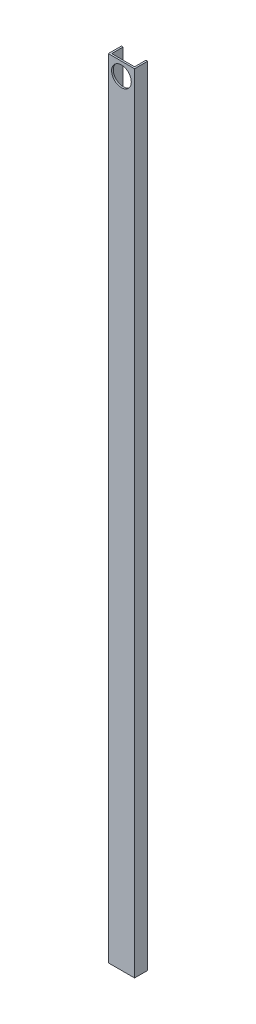
ISO-10303-21;
HEADER;
FILE_DESCRIPTION(('STEP AP214'),'2;1');
FILE_NAME('part.step','',(''),(''),'','','');
FILE_SCHEMA(('AUTOMOTIVE_DESIGN { 1 0 10303 214 1 1 1 1 }'));
ENDSEC;
DATA;
#1=APPLICATION_CONTEXT('core data for automotive mechanical design processes');
#2=APPLICATION_PROTOCOL_DEFINITION('international standard','automotive_design',2000,#1);
#3=PRODUCT_CONTEXT('',#1,'mechanical');
#4=PRODUCT('Part','Part','',(#3));
#5=PRODUCT_RELATED_PRODUCT_CATEGORY('part','',(#4));
#6=PRODUCT_DEFINITION_FORMATION('','',#4);
#7=PRODUCT_DEFINITION_CONTEXT('part definition',#1,'design');
#8=PRODUCT_DEFINITION('design','',#6,#7);
#9=PRODUCT_DEFINITION_SHAPE('','',#8);
#10=(LENGTH_UNIT() NAMED_UNIT(*) SI_UNIT(.MILLI.,.METRE.));
#11=(NAMED_UNIT(*) PLANE_ANGLE_UNIT() SI_UNIT($,.RADIAN.));
#12=(NAMED_UNIT(*) SI_UNIT($,.STERADIAN.) SOLID_ANGLE_UNIT());
#13=UNCERTAINTY_MEASURE_WITH_UNIT(LENGTH_MEASURE(1.E-05),#10,'distance_accuracy_value','');
#14=(GEOMETRIC_REPRESENTATION_CONTEXT(3) GLOBAL_UNCERTAINTY_ASSIGNED_CONTEXT((#13)) GLOBAL_UNIT_ASSIGNED_CONTEXT((#10,
#11,#12)) REPRESENTATION_CONTEXT('',''));
#15=CARTESIAN_POINT('',(0.,0.,0.));
#16=DIRECTION('',(0.,0.,1.));
#17=DIRECTION('',(1.,0.,0.));
#18=AXIS2_PLACEMENT_3D('',#15,#16,#17);
#19=CARTESIAN_POINT('',(0.,1524.,-25.4));
#20=DIRECTION('',(1.,0.,0.));
#21=DIRECTION('',(0.,0.,-1.));
#22=AXIS2_PLACEMENT_3D('',#19,#20,#21);
#23=PLANE('',#22);
#24=DIRECTION('',(0.,0.,1.));
#25=VECTOR('',#24,1.);
#26=CARTESIAN_POINT('',(0.,0.,-25.4));
#27=LINE('',#26,#25);
#28=CARTESIAN_POINT('',(0.,0.,-25.4));
#29=VERTEX_POINT('',#28);
#30=CARTESIAN_POINT('',(0.,0.,0.));
#31=VERTEX_POINT('',#30);
#32=EDGE_CURVE('E129',#29,#31,#27,.T.);
#33=ORIENTED_EDGE('',*,*,#32,.T.);
#34=DIRECTION('',(0.,-1.,0.));
#35=VECTOR('',#34,1.);
#36=CARTESIAN_POINT('',(0.,1524.,0.));
#37=LINE('',#36,#35);
#38=CARTESIAN_POINT('',(0.,1524.,0.));
#39=VERTEX_POINT('',#38);
#40=EDGE_CURVE('E11',#39,#31,#37,.T.);
#41=ORIENTED_EDGE('',*,*,#40,.F.);
#42=DIRECTION('',(0.,0.,1.));
#43=VECTOR('',#42,1.);
#44=CARTESIAN_POINT('',(0.,1524.,-25.4));
#45=LINE('',#44,#43);
#46=CARTESIAN_POINT('',(0.,1524.,-25.4));
#47=VERTEX_POINT('',#46);
#48=EDGE_CURVE('E144',#47,#39,#45,.T.);
#49=ORIENTED_EDGE('',*,*,#48,.F.);
#50=DIRECTION('',(0.,-1.,0.));
#51=VECTOR('',#50,1.);
#52=CARTESIAN_POINT('',(0.,1524.,-25.4));
#53=LINE('',#52,#51);
#54=EDGE_CURVE('E125',#47,#29,#53,.T.);
#55=ORIENTED_EDGE('',*,*,#54,.T.);
#56=EDGE_LOOP('',(#33,#41,#49,#55));
#57=FACE_BOUND('',#56,.T.);
#58=ADVANCED_FACE('F33',(#57),#23,.F.);
#59=CARTESIAN_POINT('',(0.,1524.,0.));
#60=DIRECTION('',(0.,0.,-1.));
#61=DIRECTION('',(-1.,0.,0.));
#62=AXIS2_PLACEMENT_3D('',#59,#60,#61);
#63=PLANE('',#62);
#64=CARTESIAN_POINT('',(25.4,1498.6,0.));
#65=DIRECTION('',(0.,0.,1.));
#66=DIRECTION('',(1.,0.,0.));
#67=AXIS2_PLACEMENT_3D('',#64,#65,#66);
#68=CIRCLE('',#67,19.05);
#69=CARTESIAN_POINT('',(44.45,1498.6,0.));
#70=VERTEX_POINT('',#69);
#71=EDGE_CURVE('E177',#70,#70,#68,.T.);
#72=ORIENTED_EDGE('',*,*,#71,.F.);
#73=EDGE_LOOP('',(#72));
#74=FACE_BOUND('',#73,.T.);
#75=DIRECTION('',(1.,0.,0.));
#76=VECTOR('',#75,1.);
#77=CARTESIAN_POINT('',(0.,0.,0.));
#78=LINE('',#77,#76);
#79=CARTESIAN_POINT('',(50.8,0.,0.));
#80=VERTEX_POINT('',#79);
#81=EDGE_CURVE('E132',#31,#80,#78,.T.);
#82=ORIENTED_EDGE('',*,*,#81,.T.);
#83=DIRECTION('',(0.,-1.,0.));
#84=VECTOR('',#83,1.);
#85=CARTESIAN_POINT('',(50.8,1524.,0.));
#86=LINE('',#85,#84);
#87=CARTESIAN_POINT('',(50.8,1524.,0.));
#88=VERTEX_POINT('',#87);
#89=EDGE_CURVE('E41',#88,#80,#86,.T.);
#90=ORIENTED_EDGE('',*,*,#89,.F.);
#91=DIRECTION('',(1.,0.,0.));
#92=VECTOR('',#91,1.);
#93=CARTESIAN_POINT('',(0.,1524.,0.));
#94=LINE('',#93,#92);
#95=EDGE_CURVE('E92',#39,#88,#94,.T.);
#96=ORIENTED_EDGE('',*,*,#95,.F.);
#97=ORIENTED_EDGE('',*,*,#40,.T.);
#98=EDGE_LOOP('',(#82,#90,#96,#97));
#99=FACE_BOUND('',#98,.T.);
#100=ADVANCED_FACE('F190',(#74,#99),#63,.F.);
#101=CARTESIAN_POINT('',(50.8,1524.,0.));
#102=DIRECTION('',(-1.,0.,0.));
#103=DIRECTION('',(0.,0.,1.));
#104=AXIS2_PLACEMENT_3D('',#101,#102,#103);
#105=PLANE('',#104);
#106=DIRECTION('',(0.,0.,-1.));
#107=VECTOR('',#106,1.);
#108=CARTESIAN_POINT('',(50.8,0.,0.));
#109=LINE('',#108,#107);
#110=CARTESIAN_POINT('',(50.8,0.,-25.4));
#111=VERTEX_POINT('',#110);
#112=EDGE_CURVE('E135',#80,#111,#109,.T.);
#113=ORIENTED_EDGE('',*,*,#112,.T.);
#114=DIRECTION('',(0.,-1.,0.));
#115=VECTOR('',#114,1.);
#116=CARTESIAN_POINT('',(50.8,1524.,-25.4));
#117=LINE('',#116,#115);
#118=CARTESIAN_POINT('',(50.8,1524.,-25.4));
#119=VERTEX_POINT('',#118);
#120=EDGE_CURVE('E151',#119,#111,#117,.T.);
#121=ORIENTED_EDGE('',*,*,#120,.F.);
#122=DIRECTION('',(0.,0.,-1.));
#123=VECTOR('',#122,1.);
#124=CARTESIAN_POINT('',(50.8,1524.,0.));
#125=LINE('',#124,#123);
#126=EDGE_CURVE('E159',#88,#119,#125,.T.);
#127=ORIENTED_EDGE('',*,*,#126,.F.);
#128=ORIENTED_EDGE('',*,*,#89,.T.);
#129=EDGE_LOOP('',(#113,#121,#127,#128));
#130=FACE_BOUND('',#129,.T.);
#131=ADVANCED_FACE('F157',(#130),#105,.F.);
#132=CARTESIAN_POINT('',(50.8,1524.,-25.4));
#133=DIRECTION('',(0.,0.,1.));
#134=DIRECTION('',(1.,0.,0.));
#135=AXIS2_PLACEMENT_3D('',#132,#133,#134);
#136=PLANE('',#135);
#137=DIRECTION('',(-1.,0.,0.));
#138=VECTOR('',#137,1.);
#139=CARTESIAN_POINT('',(50.8,0.,-25.4));
#140=LINE('',#139,#138);
#141=CARTESIAN_POINT('',(47.498,0.,-25.4));
#142=VERTEX_POINT('',#141);
#143=EDGE_CURVE('E137',#111,#142,#140,.T.);
#144=ORIENTED_EDGE('',*,*,#143,.T.);
#145=DIRECTION('',(0.,-1.,0.));
#146=VECTOR('',#145,1.);
#147=CARTESIAN_POINT('',(47.498,1524.,-25.4));
#148=LINE('',#147,#146);
#149=CARTESIAN_POINT('',(47.498,1524.,-25.4));
#150=VERTEX_POINT('',#149);
#151=EDGE_CURVE('E148',#150,#142,#148,.T.);
#152=ORIENTED_EDGE('',*,*,#151,.F.);
#153=DIRECTION('',(-1.,0.,0.));
#154=VECTOR('',#153,1.);
#155=CARTESIAN_POINT('',(50.8,1524.,-25.4));
#156=LINE('',#155,#154);
#157=EDGE_CURVE('E171',#119,#150,#156,.T.);
#158=ORIENTED_EDGE('',*,*,#157,.F.);
#159=ORIENTED_EDGE('',*,*,#120,.T.);
#160=EDGE_LOOP('',(#144,#152,#158,#159));
#161=FACE_BOUND('',#160,.T.);
#162=ADVANCED_FACE('F167',(#161),#136,.F.);
#163=CARTESIAN_POINT('',(47.498,1524.,-25.4));
#164=DIRECTION('',(1.,0.,0.));
#165=DIRECTION('',(0.,0.,-1.));
#166=AXIS2_PLACEMENT_3D('',#163,#164,#165);
#167=PLANE('',#166);
#168=DIRECTION('',(0.,0.,1.));
#169=VECTOR('',#168,1.);
#170=CARTESIAN_POINT('',(47.498,0.,-25.4));
#171=LINE('',#170,#169);
#172=CARTESIAN_POINT('',(47.498,0.,-3.302));
#173=VERTEX_POINT('',#172);
#174=EDGE_CURVE('E139',#142,#173,#171,.T.);
#175=ORIENTED_EDGE('',*,*,#174,.T.);
#176=DIRECTION('',(0.,-1.,0.));
#177=VECTOR('',#176,1.);
#178=CARTESIAN_POINT('',(47.498,1524.,-3.302));
#179=LINE('',#178,#177);
#180=CARTESIAN_POINT('',(47.498,1524.,-3.302));
#181=VERTEX_POINT('',#180);
#182=EDGE_CURVE('E120',#181,#173,#179,.T.);
#183=ORIENTED_EDGE('',*,*,#182,.F.);
#184=DIRECTION('',(0.,0.,1.));
#185=VECTOR('',#184,1.);
#186=CARTESIAN_POINT('',(47.498,1524.,-25.4));
#187=LINE('',#186,#185);
#188=EDGE_CURVE('E111',#150,#181,#187,.T.);
#189=ORIENTED_EDGE('',*,*,#188,.F.);
#190=ORIENTED_EDGE('',*,*,#151,.T.);
#191=EDGE_LOOP('',(#175,#183,#189,#190));
#192=FACE_BOUND('',#191,.T.);
#193=ADVANCED_FACE('F170',(#192),#167,.F.);
#194=CARTESIAN_POINT('',(47.498,1524.,-3.302));
#195=DIRECTION('',(0.,0.,1.));
#196=DIRECTION('',(1.,0.,0.));
#197=AXIS2_PLACEMENT_3D('',#194,#195,#196);
#198=PLANE('',#197);
#199=CARTESIAN_POINT('',(25.4,1498.6,-3.302));
#200=DIRECTION('',(0.,0.,1.));
#201=DIRECTION('',(1.,0.,0.));
#202=AXIS2_PLACEMENT_3D('',#199,#200,#201);
#203=CIRCLE('',#202,19.05);
#204=CARTESIAN_POINT('',(44.45,1498.6,-3.302));
#205=VERTEX_POINT('',#204);
#206=EDGE_CURVE('E133',#205,#205,#203,.T.);
#207=ORIENTED_EDGE('',*,*,#206,.T.);
#208=EDGE_LOOP('',(#207));
#209=FACE_BOUND('',#208,.T.);
#210=DIRECTION('',(-1.,0.,0.));
#211=VECTOR('',#210,1.);
#212=CARTESIAN_POINT('',(47.498,0.,-3.302));
#213=LINE('',#212,#211);
#214=CARTESIAN_POINT('',(3.302,0.,-3.30199999999999));
#215=VERTEX_POINT('',#214);
#216=EDGE_CURVE('E119',#173,#215,#213,.T.);
#217=ORIENTED_EDGE('',*,*,#216,.T.);
#218=DIRECTION('',(0.,-1.,0.));
#219=VECTOR('',#218,1.);
#220=CARTESIAN_POINT('',(3.302,1524.,-3.30199999999999));
#221=LINE('',#220,#219);
#222=CARTESIAN_POINT('',(3.302,1524.,-3.30199999999999));
#223=VERTEX_POINT('',#222);
#224=EDGE_CURVE('E116',#223,#215,#221,.T.);
#225=ORIENTED_EDGE('',*,*,#224,.F.);
#226=DIRECTION('',(-1.,0.,0.));
#227=VECTOR('',#226,1.);
#228=CARTESIAN_POINT('',(47.498,1524.,-3.302));
#229=LINE('',#228,#227);
#230=EDGE_CURVE('E105',#181,#223,#229,.T.);
#231=ORIENTED_EDGE('',*,*,#230,.F.);
#232=ORIENTED_EDGE('',*,*,#182,.T.);
#233=EDGE_LOOP('',(#217,#225,#231,#232));
#234=FACE_BOUND('',#233,.T.);
#235=ADVANCED_FACE('F117',(#209,#234),#198,.F.);
#236=CARTESIAN_POINT('',(3.302,1524.,-3.30199999999999));
#237=DIRECTION('',(-1.,0.,0.));
#238=DIRECTION('',(0.,0.,1.));
#239=AXIS2_PLACEMENT_3D('',#236,#237,#238);
#240=PLANE('',#239);
#241=DIRECTION('',(0.,0.,-1.));
#242=VECTOR('',#241,1.);
#243=CARTESIAN_POINT('',(3.302,0.,-3.30199999999999));
#244=LINE('',#243,#242);
#245=CARTESIAN_POINT('',(3.302,0.,-25.4));
#246=VERTEX_POINT('',#245);
#247=EDGE_CURVE('E78',#215,#246,#244,.T.);
#248=ORIENTED_EDGE('',*,*,#247,.T.);
#249=DIRECTION('',(0.,-1.,0.));
#250=VECTOR('',#249,1.);
#251=CARTESIAN_POINT('',(3.302,1524.,-25.4));
#252=LINE('',#251,#250);
#253=CARTESIAN_POINT('',(3.302,1524.,-25.4));
#254=VERTEX_POINT('',#253);
#255=EDGE_CURVE('E121',#254,#246,#252,.T.);
#256=ORIENTED_EDGE('',*,*,#255,.F.);
#257=DIRECTION('',(0.,0.,-1.));
#258=VECTOR('',#257,1.);
#259=CARTESIAN_POINT('',(3.302,1524.,-3.30199999999999));
#260=LINE('',#259,#258);
#261=EDGE_CURVE('E109',#223,#254,#260,.T.);
#262=ORIENTED_EDGE('',*,*,#261,.F.);
#263=ORIENTED_EDGE('',*,*,#224,.T.);
#264=EDGE_LOOP('',(#248,#256,#262,#263));
#265=FACE_BOUND('',#264,.T.);
#266=ADVANCED_FACE('F123',(#265),#240,.F.);
#267=CARTESIAN_POINT('',(3.302,1524.,-25.4));
#268=DIRECTION('',(0.,0.,1.));
#269=DIRECTION('',(1.,0.,0.));
#270=AXIS2_PLACEMENT_3D('',#267,#268,#269);
#271=PLANE('',#270);
#272=DIRECTION('',(-1.,0.,0.));
#273=VECTOR('',#272,1.);
#274=CARTESIAN_POINT('',(3.302,0.,-25.4));
#275=LINE('',#274,#273);
#276=EDGE_CURVE('E84',#246,#29,#275,.T.);
#277=ORIENTED_EDGE('',*,*,#276,.T.);
#278=ORIENTED_EDGE('',*,*,#54,.F.);
#279=DIRECTION('',(-1.,0.,0.));
#280=VECTOR('',#279,1.);
#281=CARTESIAN_POINT('',(3.302,1524.,-25.4));
#282=LINE('',#281,#280);
#283=EDGE_CURVE('E49',#254,#47,#282,.T.);
#284=ORIENTED_EDGE('',*,*,#283,.F.);
#285=ORIENTED_EDGE('',*,*,#255,.T.);
#286=EDGE_LOOP('',(#277,#278,#284,#285));
#287=FACE_BOUND('',#286,.T.);
#288=ADVANCED_FACE('F195',(#287),#271,.F.);
#289=CARTESIAN_POINT('',(0.,1524.,0.));
#290=DIRECTION('',(0.,1.,0.));
#291=DIRECTION('',(0.,0.,1.));
#292=AXIS2_PLACEMENT_3D('',#289,#290,#291);
#293=PLANE('',#292);
#294=ORIENTED_EDGE('',*,*,#48,.T.);
#295=ORIENTED_EDGE('',*,*,#95,.T.);
#296=ORIENTED_EDGE('',*,*,#126,.T.);
#297=ORIENTED_EDGE('',*,*,#157,.T.);
#298=ORIENTED_EDGE('',*,*,#188,.T.);
#299=ORIENTED_EDGE('',*,*,#230,.T.);
#300=ORIENTED_EDGE('',*,*,#261,.T.);
#301=ORIENTED_EDGE('',*,*,#283,.T.);
#302=EDGE_LOOP('',(#294,#295,#296,#297,#298,#299,#300,#301));
#303=FACE_BOUND('',#302,.T.);
#304=ADVANCED_FACE('F107',(#303),#293,.T.);
#305=CARTESIAN_POINT('',(0.,0.,0.));
#306=DIRECTION('',(0.,1.,0.));
#307=DIRECTION('',(0.,0.,1.));
#308=AXIS2_PLACEMENT_3D('',#305,#306,#307);
#309=PLANE('',#308);
#310=ORIENTED_EDGE('',*,*,#32,.F.);
#311=ORIENTED_EDGE('',*,*,#276,.F.);
#312=ORIENTED_EDGE('',*,*,#247,.F.);
#313=ORIENTED_EDGE('',*,*,#216,.F.);
#314=ORIENTED_EDGE('',*,*,#174,.F.);
#315=ORIENTED_EDGE('',*,*,#143,.F.);
#316=ORIENTED_EDGE('',*,*,#112,.F.);
#317=ORIENTED_EDGE('',*,*,#81,.F.);
#318=EDGE_LOOP('',(#310,#311,#312,#313,#314,#315,#316,#317));
#319=FACE_BOUND('',#318,.T.);
#320=ADVANCED_FACE('F163',(#319),#309,.F.);
#321=CARTESIAN_POINT('',(25.4,1498.6,-3.302));
#322=DIRECTION('',(0.,0.,1.));
#323=DIRECTION('',(1.,0.,0.));
#324=AXIS2_PLACEMENT_3D('',#321,#322,#323);
#325=CYLINDRICAL_SURFACE('',#324,19.05);
#326=CARTESIAN_POINT('',(44.45,1498.6,-3.302));
#327=CARTESIAN_POINT('',(44.45,1498.6,-3.26760416666667));
#328=CARTESIAN_POINT('',(44.45,1498.6,-3.23320833333333));
#329=CARTESIAN_POINT('',(44.45,1498.6,-3.16441666666667));
#330=CARTESIAN_POINT('',(44.45,1498.6,-3.13002083333333));
#331=CARTESIAN_POINT('',(44.45,1498.6,-3.06122916666667));
#332=CARTESIAN_POINT('',(44.45,1498.6,-3.02683333333333));
#333=CARTESIAN_POINT('',(44.45,1498.6,-2.95804166666667));
#334=CARTESIAN_POINT('',(44.45,1498.6,-2.92364583333333));
#335=CARTESIAN_POINT('',(44.45,1498.6,-2.85485416666667));
#336=CARTESIAN_POINT('',(44.45,1498.6,-2.82045833333333));
#337=CARTESIAN_POINT('',(44.45,1498.6,-2.75166666666667));
#338=CARTESIAN_POINT('',(44.45,1498.6,-2.71727083333333));
#339=CARTESIAN_POINT('',(44.45,1498.6,-2.64847916666667));
#340=CARTESIAN_POINT('',(44.45,1498.6,-2.61408333333333));
#341=CARTESIAN_POINT('',(44.45,1498.6,-2.54529166666667));
#342=CARTESIAN_POINT('',(44.45,1498.6,-2.51089583333333));
#343=CARTESIAN_POINT('',(44.45,1498.6,-2.44210416666667));
#344=CARTESIAN_POINT('',(44.45,1498.6,-2.40770833333333));
#345=CARTESIAN_POINT('',(44.45,1498.6,-2.33891666666667));
#346=CARTESIAN_POINT('',(44.45,1498.6,-2.30452083333333));
#347=CARTESIAN_POINT('',(44.45,1498.6,-2.23572916666667));
#348=CARTESIAN_POINT('',(44.45,1498.6,-2.20133333333333));
#349=CARTESIAN_POINT('',(44.45,1498.6,-2.13254166666667));
#350=CARTESIAN_POINT('',(44.45,1498.6,-2.09814583333333));
#351=CARTESIAN_POINT('',(44.45,1498.6,-2.02935416666667));
#352=CARTESIAN_POINT('',(44.45,1498.6,-1.99495833333333));
#353=CARTESIAN_POINT('',(44.45,1498.6,-1.92616666666667));
#354=CARTESIAN_POINT('',(44.45,1498.6,-1.89177083333333));
#355=CARTESIAN_POINT('',(44.45,1498.6,-1.82297916666667));
#356=CARTESIAN_POINT('',(44.45,1498.6,-1.78858333333333));
#357=CARTESIAN_POINT('',(44.45,1498.6,-1.71979166666667));
#358=CARTESIAN_POINT('',(44.45,1498.6,-1.68539583333333));
#359=CARTESIAN_POINT('',(44.45,1498.6,-1.61660416666667));
#360=CARTESIAN_POINT('',(44.45,1498.6,-1.58220833333333));
#361=CARTESIAN_POINT('',(44.45,1498.6,-1.51341666666667));
#362=CARTESIAN_POINT('',(44.45,1498.6,-1.47902083333333));
#363=CARTESIAN_POINT('',(44.45,1498.6,-1.41022916666667));
#364=CARTESIAN_POINT('',(44.45,1498.6,-1.37583333333333));
#365=CARTESIAN_POINT('',(44.45,1498.6,-1.30704166666667));
#366=CARTESIAN_POINT('',(44.45,1498.6,-1.27264583333333));
#367=CARTESIAN_POINT('',(44.45,1498.6,-1.20385416666667));
#368=CARTESIAN_POINT('',(44.45,1498.6,-1.16945833333333));
#369=CARTESIAN_POINT('',(44.45,1498.6,-1.10066666666667));
#370=CARTESIAN_POINT('',(44.45,1498.6,-1.06627083333333));
#371=CARTESIAN_POINT('',(44.45,1498.6,-0.997479166666667));
#372=CARTESIAN_POINT('',(44.45,1498.6,-0.963083333333334));
#373=CARTESIAN_POINT('',(44.45,1498.6,-0.894291666666667));
#374=CARTESIAN_POINT('',(44.45,1498.6,-0.859895833333334));
#375=CARTESIAN_POINT('',(44.45,1498.6,-0.791104166666667));
#376=CARTESIAN_POINT('',(44.45,1498.6,-0.756708333333334));
#377=CARTESIAN_POINT('',(44.45,1498.6,-0.687916666666667));
#378=CARTESIAN_POINT('',(44.45,1498.6,-0.653520833333334));
#379=CARTESIAN_POINT('',(44.45,1498.6,-0.584729166666667));
#380=CARTESIAN_POINT('',(44.45,1498.6,-0.550333333333333));
#381=CARTESIAN_POINT('',(44.45,1498.6,-0.481541666666667));
#382=CARTESIAN_POINT('',(44.45,1498.6,-0.447145833333333));
#383=CARTESIAN_POINT('',(44.45,1498.6,-0.378354166666667));
#384=CARTESIAN_POINT('',(44.45,1498.6,-0.343958333333333));
#385=CARTESIAN_POINT('',(44.45,1498.6,-0.275166666666667));
#386=CARTESIAN_POINT('',(44.45,1498.6,-0.240770833333333));
#387=CARTESIAN_POINT('',(44.45,1498.6,-0.171979166666667));
#388=CARTESIAN_POINT('',(44.45,1498.6,-0.137583333333333));
#389=CARTESIAN_POINT('',(44.45,1498.6,-0.0687916666666667));
#390=CARTESIAN_POINT('',(44.45,1498.6,-0.0343958333333333));
#391=CARTESIAN_POINT('',(44.45,1498.6,0.));
#392=B_SPLINE_CURVE_WITH_KNOTS('',3,(#326,#327,#328,#329,#330,#331,#332,#333,#334,#335,#336,
#337,#338,#339,#340,#341,#342,#343,#344,#345,#346,#347,#348,#349,#350,#351,#352,#353,#354,#355,
#356,#357,#358,#359,#360,#361,#362,#363,#364,#365,#366,#367,#368,#369,#370,#371,#372,#373,#374,
#375,#376,#377,#378,#379,#380,#381,#382,#383,#384,#385,#386,#387,#388,#389,#390,#391),
.UNSPECIFIED.,.F.,.F.,(4,2,2,2,2,2,2,2,2,2,2,2,2,2,2,2,2,2,2,2,2,2,2,2,2,2,2,2,2,2,2,2,4),(0.,
0.1031875,0.206375,0.3095625,0.41275,0.5159375,0.619125,0.7223125,0.8255,0.9286875,1.031875,
1.1350625,1.23825,1.3414375,1.444625,1.5478125,1.651,1.7541875,1.857375,1.9605625,2.06375,
2.1669375,2.270125,2.3733125,2.4765,2.5796875,2.682875,2.7860625,2.88925,2.9924375,3.095625,
3.1988125,3.302),.UNSPECIFIED.);
#393=EDGE_CURVE('BSEAM184',#205,#70,#392,.T.);
#394=ORIENTED_EDGE('',*,*,#206,.F.);
#395=ORIENTED_EDGE('',*,*,#71,.T.);
#396=ORIENTED_EDGE('',*,*,#393,.T.);
#397=ORIENTED_EDGE('',*,*,#393,.F.);
#398=EDGE_LOOP('',(#394,#396,#395,#397));
#399=FACE_BOUND('',#398,.T.);
#400=ADVANCED_FACE('F184',(#399),#325,.F.);
#401=CLOSED_SHELL('',(#58,#100,#131,#162,#193,#235,#266,#288,#304,#320,#400));
#402=MANIFOLD_SOLID_BREP('B2',#401);
#403=ADVANCED_BREP_SHAPE_REPRESENTATION('',(#18,#402),#14);
#404=SHAPE_DEFINITION_REPRESENTATION(#9,#403);
ENDSEC;
END-ISO-10303-21;
